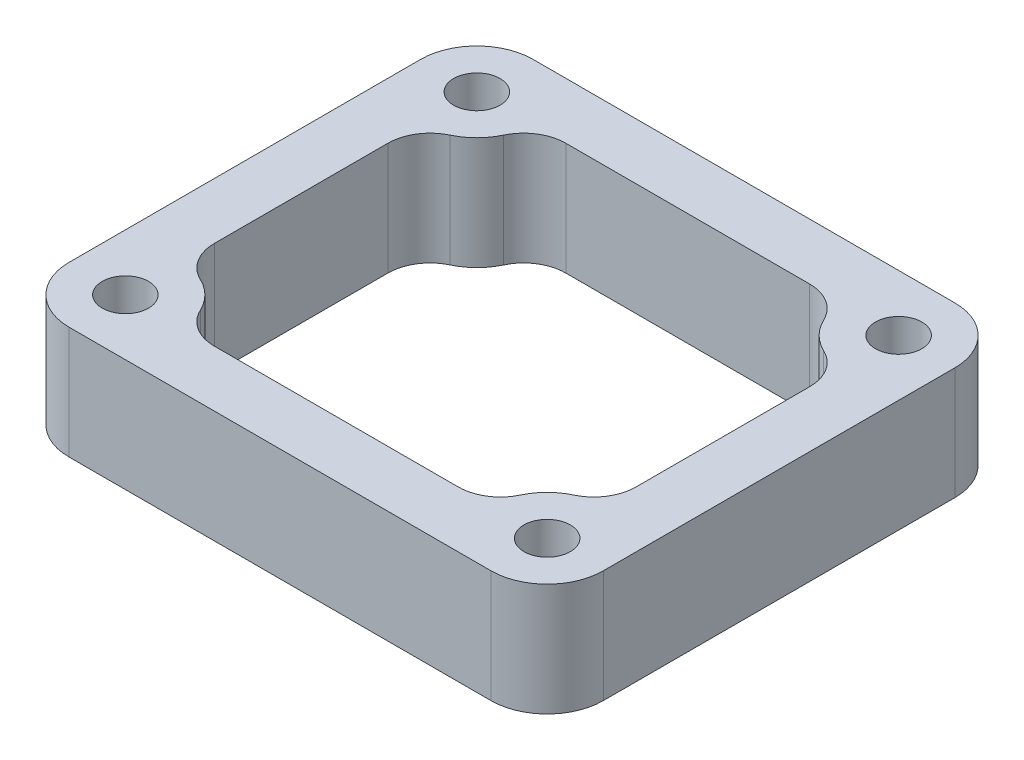
ISO-10303-21;
HEADER;
FILE_DESCRIPTION(('STEP AP214'),'2;1');
FILE_NAME('part.step','',(''),(''),'','','');
FILE_SCHEMA(('AUTOMOTIVE_DESIGN { 1 0 10303 214 1 1 1 1 }'));
ENDSEC;
DATA;
#1=APPLICATION_CONTEXT('core data for automotive mechanical design processes');
#2=APPLICATION_PROTOCOL_DEFINITION('international standard','automotive_design',2000,#1);
#3=PRODUCT_CONTEXT('',#1,'mechanical');
#4=PRODUCT('Part','Part','',(#3));
#5=PRODUCT_RELATED_PRODUCT_CATEGORY('part','',(#4));
#6=PRODUCT_DEFINITION_FORMATION('','',#4);
#7=PRODUCT_DEFINITION_CONTEXT('part definition',#1,'design');
#8=PRODUCT_DEFINITION('design','',#6,#7);
#9=PRODUCT_DEFINITION_SHAPE('','',#8);
#10=(LENGTH_UNIT() NAMED_UNIT(*) SI_UNIT(.MILLI.,.METRE.));
#11=(NAMED_UNIT(*) PLANE_ANGLE_UNIT() SI_UNIT($,.RADIAN.));
#12=(NAMED_UNIT(*) SI_UNIT($,.STERADIAN.) SOLID_ANGLE_UNIT());
#13=UNCERTAINTY_MEASURE_WITH_UNIT(LENGTH_MEASURE(1.E-05),#10,'distance_accuracy_value','');
#14=(GEOMETRIC_REPRESENTATION_CONTEXT(3) GLOBAL_UNCERTAINTY_ASSIGNED_CONTEXT((#13)) GLOBAL_UNIT_ASSIGNED_CONTEXT((#10,
#11,#12)) REPRESENTATION_CONTEXT('',''));
#15=CARTESIAN_POINT('',(0.,0.,0.));
#16=DIRECTION('',(0.,0.,1.));
#17=DIRECTION('',(1.,0.,0.));
#18=AXIS2_PLACEMENT_3D('',#15,#16,#17);
#19=CARTESIAN_POINT('',(-15.,8.,-12.5));
#20=DIRECTION('',(0.,1.,0.));
#21=DIRECTION('',(0.,0.,1.));
#22=AXIS2_PLACEMENT_3D('',#19,#20,#21);
#23=PLANE('',#22);
#24=CARTESIAN_POINT('',(-15.,8.,12.5));
#25=DIRECTION('',(0.,1.,0.));
#26=DIRECTION('',(0.,0.,1.));
#27=AXIS2_PLACEMENT_3D('',#24,#25,#26);
#28=CIRCLE('',#27,1.65);
#29=CARTESIAN_POINT('',(-15.,8.,14.15));
#30=VERTEX_POINT('',#29);
#31=EDGE_CURVE('E354',#30,#30,#28,.T.);
#32=ORIENTED_EDGE('',*,*,#31,.F.);
#33=EDGE_LOOP('',(#32));
#34=FACE_BOUND('',#33,.T.);
#35=CARTESIAN_POINT('',(-15.,8.,-12.5));
#36=DIRECTION('',(0.,1.,0.));
#37=DIRECTION('',(0.,0.,1.));
#38=AXIS2_PLACEMENT_3D('',#35,#36,#37);
#39=CIRCLE('',#38,1.65);
#40=CARTESIAN_POINT('',(-15.,8.,-10.85));
#41=VERTEX_POINT('',#40);
#42=EDGE_CURVE('E366',#41,#41,#39,.T.);
#43=ORIENTED_EDGE('',*,*,#42,.F.);
#44=EDGE_LOOP('',(#43));
#45=FACE_BOUND('',#44,.T.);
#46=CARTESIAN_POINT('',(-15.,8.,-12.5));
#47=DIRECTION('',(0.,1.,0.));
#48=DIRECTION('',(0.,0.,1.));
#49=AXIS2_PLACEMENT_3D('',#46,#47,#48);
#50=CIRCLE('',#49,4.);
#51=CARTESIAN_POINT('',(-15.,8.,-16.5));
#52=VERTEX_POINT('',#51);
#53=CARTESIAN_POINT('',(-19.,8.,-12.5));
#54=VERTEX_POINT('',#53);
#55=EDGE_CURVE('E216',#52,#54,#50,.T.);
#56=ORIENTED_EDGE('',*,*,#55,.T.);
#57=DIRECTION('',(0.,0.,1.));
#58=VECTOR('',#57,1.);
#59=CARTESIAN_POINT('',(-19.,8.,-12.5));
#60=LINE('',#59,#58);
#61=CARTESIAN_POINT('',(-19.,8.,12.5));
#62=VERTEX_POINT('',#61);
#63=EDGE_CURVE('E205',#54,#62,#60,.T.);
#64=ORIENTED_EDGE('',*,*,#63,.T.);
#65=CARTESIAN_POINT('',(-15.,8.,12.5));
#66=DIRECTION('',(0.,1.,0.));
#67=DIRECTION('',(0.,0.,1.));
#68=AXIS2_PLACEMENT_3D('',#65,#66,#67);
#69=CIRCLE('',#68,4.);
#70=CARTESIAN_POINT('',(-15.,8.,16.5));
#71=VERTEX_POINT('',#70);
#72=EDGE_CURVE('E215',#62,#71,#69,.T.);
#73=ORIENTED_EDGE('',*,*,#72,.T.);
#74=DIRECTION('',(1.,0.,0.));
#75=VECTOR('',#74,1.);
#76=CARTESIAN_POINT('',(15.,8.,16.5));
#77=LINE('',#76,#75);
#78=CARTESIAN_POINT('',(15.,8.,16.5));
#79=VERTEX_POINT('',#78);
#80=EDGE_CURVE('E372',#71,#79,#77,.T.);
#81=ORIENTED_EDGE('',*,*,#80,.T.);
#82=CARTESIAN_POINT('',(15.,8.,12.5));
#83=DIRECTION('',(0.,1.,0.));
#84=DIRECTION('',(0.,0.,1.));
#85=AXIS2_PLACEMENT_3D('',#82,#83,#84);
#86=CIRCLE('',#85,4.);
#87=CARTESIAN_POINT('',(19.,8.,12.5));
#88=VERTEX_POINT('',#87);
#89=EDGE_CURVE('E374',#79,#88,#86,.T.);
#90=ORIENTED_EDGE('',*,*,#89,.T.);
#91=DIRECTION('',(0.,0.,-1.));
#92=VECTOR('',#91,1.);
#93=CARTESIAN_POINT('',(19.,8.,-12.5));
#94=LINE('',#93,#92);
#95=CARTESIAN_POINT('',(19.,8.,-12.5));
#96=VERTEX_POINT('',#95);
#97=EDGE_CURVE('E376',#88,#96,#94,.T.);
#98=ORIENTED_EDGE('',*,*,#97,.T.);
#99=CARTESIAN_POINT('',(15.,8.,-12.5));
#100=DIRECTION('',(0.,1.,0.));
#101=DIRECTION('',(0.,0.,1.));
#102=AXIS2_PLACEMENT_3D('',#99,#100,#101);
#103=CIRCLE('',#102,4.);
#104=CARTESIAN_POINT('',(15.,8.,-16.5));
#105=VERTEX_POINT('',#104);
#106=EDGE_CURVE('E378',#96,#105,#103,.T.);
#107=ORIENTED_EDGE('',*,*,#106,.T.);
#108=DIRECTION('',(-1.,0.,0.));
#109=VECTOR('',#108,1.);
#110=CARTESIAN_POINT('',(-15.,8.,-16.5));
#111=LINE('',#110,#109);
#112=EDGE_CURVE('E221',#105,#52,#111,.T.);
#113=ORIENTED_EDGE('',*,*,#112,.T.);
#114=EDGE_LOOP('',(#56,#64,#73,#81,#90,#98,#107,#113));
#115=FACE_BOUND('',#114,.T.);
#116=CARTESIAN_POINT('',(15.,8.,-12.5));
#117=DIRECTION('',(0.,1.,0.));
#118=DIRECTION('',(0.,0.,1.));
#119=AXIS2_PLACEMENT_3D('',#116,#117,#118);
#120=CIRCLE('',#119,1.65);
#121=CARTESIAN_POINT('',(15.,8.,-10.85));
#122=VERTEX_POINT('',#121);
#123=EDGE_CURVE('E360',#122,#122,#120,.T.);
#124=ORIENTED_EDGE('',*,*,#123,.F.);
#125=EDGE_LOOP('',(#124));
#126=FACE_BOUND('',#125,.T.);
#127=CARTESIAN_POINT('',(15.,8.,12.5));
#128=DIRECTION('',(0.,1.,0.));
#129=DIRECTION('',(0.,0.,1.));
#130=AXIS2_PLACEMENT_3D('',#127,#128,#129);
#131=CIRCLE('',#130,1.65);
#132=CARTESIAN_POINT('',(15.,8.,14.15));
#133=VERTEX_POINT('',#132);
#134=EDGE_CURVE('E326',#133,#133,#131,.T.);
#135=ORIENTED_EDGE('',*,*,#134,.F.);
#136=EDGE_LOOP('',(#135));
#137=FACE_BOUND('',#136,.T.);
#138=DIRECTION('',(0.,0.,1.));
#139=VECTOR('',#138,1.);
#140=CARTESIAN_POINT('',(-15.,8.,-8.5));
#141=LINE('',#140,#139);
#142=CARTESIAN_POINT('',(-15.,8.,-6.17544467966324));
#143=VERTEX_POINT('',#142);
#144=CARTESIAN_POINT('',(-15.,8.,6.17544467966324));
#145=VERTEX_POINT('',#144);
#146=EDGE_CURVE('E716',#143,#145,#141,.T.);
#147=ORIENTED_EDGE('',*,*,#146,.F.);
#148=CARTESIAN_POINT('',(-12.,8.,-6.17544467966324));
#149=DIRECTION('',(0.,1.,0.));
#150=DIRECTION('',(0.,0.,1.));
#151=AXIS2_PLACEMENT_3D('',#148,#149,#150);
#152=CIRCLE('',#151,3.);
#153=CARTESIAN_POINT('',(-13.2857142857143,8.,-8.885968388379));
#154=VERTEX_POINT('',#153);
#155=EDGE_CURVE('E58',#143,#154,#152,.F.);
#156=ORIENTED_EDGE('',*,*,#155,.T.);
#157=CARTESIAN_POINT('',(-15.,8.,-12.5));
#158=DIRECTION('',(0.,-1.,0.));
#159=DIRECTION('',(0.,0.,1.));
#160=AXIS2_PLACEMENT_3D('',#157,#158,#159);
#161=CIRCLE('',#160,4.);
#162=CARTESIAN_POINT('',(-11.385968388379,8.,-10.7857142857143));
#163=VERTEX_POINT('',#162);
#164=EDGE_CURVE('E318',#163,#154,#161,.T.);
#165=ORIENTED_EDGE('',*,*,#164,.F.);
#166=CARTESIAN_POINT('',(-8.67544467966323,8.,-9.5));
#167=DIRECTION('',(0.,1.,0.));
#168=DIRECTION('',(0.,0.,1.));
#169=AXIS2_PLACEMENT_3D('',#166,#167,#168);
#170=CIRCLE('',#169,3.);
#171=CARTESIAN_POINT('',(-8.67544467966323,8.,-12.5));
#172=VERTEX_POINT('',#171);
#173=EDGE_CURVE('E11',#163,#172,#170,.F.);
#174=ORIENTED_EDGE('',*,*,#173,.T.);
#175=DIRECTION('',(-1.,0.,0.));
#176=VECTOR('',#175,1.);
#177=CARTESIAN_POINT('',(-11.,8.,-12.5));
#178=LINE('',#177,#176);
#179=CARTESIAN_POINT('',(8.67544467966325,8.,-12.5));
#180=VERTEX_POINT('',#179);
#181=EDGE_CURVE('E316',#180,#172,#178,.T.);
#182=ORIENTED_EDGE('',*,*,#181,.F.);
#183=CARTESIAN_POINT('',(8.67544467966325,8.,-9.5));
#184=DIRECTION('',(0.,1.,0.));
#185=DIRECTION('',(0.,0.,1.));
#186=AXIS2_PLACEMENT_3D('',#183,#184,#185);
#187=CIRCLE('',#186,3.);
#188=CARTESIAN_POINT('',(11.385968388379,8.,-10.7857142857143));
#189=VERTEX_POINT('',#188);
#190=EDGE_CURVE('E296',#180,#189,#187,.F.);
#191=ORIENTED_EDGE('',*,*,#190,.T.);
#192=CARTESIAN_POINT('',(15.,8.,-12.5));
#193=DIRECTION('',(0.,-1.,0.));
#194=DIRECTION('',(0.,0.,1.));
#195=AXIS2_PLACEMENT_3D('',#192,#193,#194);
#196=CIRCLE('',#195,4.);
#197=CARTESIAN_POINT('',(13.2857142857143,8.,-8.885968388379));
#198=VERTEX_POINT('',#197);
#199=EDGE_CURVE('E323',#198,#189,#196,.T.);
#200=ORIENTED_EDGE('',*,*,#199,.F.);
#201=CARTESIAN_POINT('',(12.,8.,-6.17544467966324));
#202=DIRECTION('',(0.,1.,0.));
#203=DIRECTION('',(0.,0.,1.));
#204=AXIS2_PLACEMENT_3D('',#201,#202,#203);
#205=CIRCLE('',#204,3.);
#206=CARTESIAN_POINT('',(15.,8.,-6.17544467966324));
#207=VERTEX_POINT('',#206);
#208=EDGE_CURVE('E292',#198,#207,#205,.F.);
#209=ORIENTED_EDGE('',*,*,#208,.T.);
#210=DIRECTION('',(0.,0.,-1.));
#211=VECTOR('',#210,1.);
#212=CARTESIAN_POINT('',(15.,8.,8.5));
#213=LINE('',#212,#211);
#214=CARTESIAN_POINT('',(15.,8.,6.17544467966325));
#215=VERTEX_POINT('',#214);
#216=EDGE_CURVE('E329',#215,#207,#213,.T.);
#217=ORIENTED_EDGE('',*,*,#216,.F.);
#218=CARTESIAN_POINT('',(12.,8.,6.17544467966325));
#219=DIRECTION('',(0.,1.,0.));
#220=DIRECTION('',(0.,0.,1.));
#221=AXIS2_PLACEMENT_3D('',#218,#219,#220);
#222=CIRCLE('',#221,3.);
#223=CARTESIAN_POINT('',(13.2857142857143,8.,8.885968388379));
#224=VERTEX_POINT('',#223);
#225=EDGE_CURVE('E288',#215,#224,#222,.F.);
#226=ORIENTED_EDGE('',*,*,#225,.T.);
#227=CARTESIAN_POINT('',(15.,8.,12.5));
#228=DIRECTION('',(0.,-1.,0.));
#229=DIRECTION('',(0.,0.,1.));
#230=AXIS2_PLACEMENT_3D('',#227,#228,#229);
#231=CIRCLE('',#230,4.);
#232=CARTESIAN_POINT('',(11.385968388379,8.,10.7857142857143));
#233=VERTEX_POINT('',#232);
#234=EDGE_CURVE('E737',#233,#224,#231,.T.);
#235=ORIENTED_EDGE('',*,*,#234,.F.);
#236=CARTESIAN_POINT('',(8.67544467966325,8.,9.5));
#237=DIRECTION('',(0.,1.,0.));
#238=DIRECTION('',(0.,0.,1.));
#239=AXIS2_PLACEMENT_3D('',#236,#237,#238);
#240=CIRCLE('',#239,3.);
#241=CARTESIAN_POINT('',(8.67544467966325,8.,12.5));
#242=VERTEX_POINT('',#241);
#243=EDGE_CURVE('E284',#233,#242,#240,.F.);
#244=ORIENTED_EDGE('',*,*,#243,.T.);
#245=DIRECTION('',(1.,0.,0.));
#246=VECTOR('',#245,1.);
#247=CARTESIAN_POINT('',(-11.,8.,12.5));
#248=LINE('',#247,#246);
#249=CARTESIAN_POINT('',(-8.67544467966323,8.,12.5));
#250=VERTEX_POINT('',#249);
#251=EDGE_CURVE('E730',#250,#242,#248,.T.);
#252=ORIENTED_EDGE('',*,*,#251,.F.);
#253=CARTESIAN_POINT('',(-8.67544467966323,8.,9.5));
#254=DIRECTION('',(0.,1.,0.));
#255=DIRECTION('',(0.,0.,1.));
#256=AXIS2_PLACEMENT_3D('',#253,#254,#255);
#257=CIRCLE('',#256,3.);
#258=CARTESIAN_POINT('',(-11.385968388379,8.,10.7857142857143));
#259=VERTEX_POINT('',#258);
#260=EDGE_CURVE('E280',#250,#259,#257,.F.);
#261=ORIENTED_EDGE('',*,*,#260,.T.);
#262=CARTESIAN_POINT('',(-15.,8.,12.5));
#263=DIRECTION('',(0.,-1.,0.));
#264=DIRECTION('',(0.,0.,1.));
#265=AXIS2_PLACEMENT_3D('',#262,#263,#264);
#266=CIRCLE('',#265,4.);
#267=CARTESIAN_POINT('',(-13.2857142857143,8.,8.885968388379));
#268=VERTEX_POINT('',#267);
#269=EDGE_CURVE('E723',#268,#259,#266,.T.);
#270=ORIENTED_EDGE('',*,*,#269,.F.);
#271=CARTESIAN_POINT('',(-12.,8.,6.17544467966324));
#272=DIRECTION('',(0.,1.,0.));
#273=DIRECTION('',(0.,0.,1.));
#274=AXIS2_PLACEMENT_3D('',#271,#272,#273);
#275=CIRCLE('',#274,3.);
#276=EDGE_CURVE('E276',#268,#145,#275,.F.);
#277=ORIENTED_EDGE('',*,*,#276,.T.);
#278=EDGE_LOOP('',(#147,#156,#165,#174,#182,#191,#200,#209,#217,#226,#235,#244,#252,#261,#270,#277));
#279=FACE_BOUND('',#278,.T.);
#280=ADVANCED_FACE('F43',(#34,#45,#115,#126,#137,#279),#23,.T.);
#281=CARTESIAN_POINT('',(-15.,0.,-12.5));
#282=DIRECTION('',(0.,1.,0.));
#283=DIRECTION('',(0.,0.,1.));
#284=AXIS2_PLACEMENT_3D('',#281,#282,#283);
#285=PLANE('',#284);
#286=CARTESIAN_POINT('',(15.,0.,12.5));
#287=DIRECTION('',(0.,1.,0.));
#288=DIRECTION('',(0.,0.,1.));
#289=AXIS2_PLACEMENT_3D('',#286,#287,#288);
#290=CIRCLE('',#289,1.65);
#291=CARTESIAN_POINT('',(15.,0.,14.15));
#292=VERTEX_POINT('',#291);
#293=EDGE_CURVE('E322',#292,#292,#290,.T.);
#294=ORIENTED_EDGE('',*,*,#293,.T.);
#295=EDGE_LOOP('',(#294));
#296=FACE_BOUND('',#295,.T.);
#297=CARTESIAN_POINT('',(-15.,0.,12.5));
#298=DIRECTION('',(0.,1.,0.));
#299=DIRECTION('',(0.,0.,1.));
#300=AXIS2_PLACEMENT_3D('',#297,#298,#299);
#301=CIRCLE('',#300,1.65);
#302=CARTESIAN_POINT('',(-15.,0.,14.15));
#303=VERTEX_POINT('',#302);
#304=EDGE_CURVE('E352',#303,#303,#301,.T.);
#305=ORIENTED_EDGE('',*,*,#304,.T.);
#306=EDGE_LOOP('',(#305));
#307=FACE_BOUND('',#306,.T.);
#308=CARTESIAN_POINT('',(15.,0.,-12.5));
#309=DIRECTION('',(0.,1.,0.));
#310=DIRECTION('',(0.,0.,1.));
#311=AXIS2_PLACEMENT_3D('',#308,#309,#310);
#312=CIRCLE('',#311,1.65);
#313=CARTESIAN_POINT('',(15.,0.,-10.85));
#314=VERTEX_POINT('',#313);
#315=EDGE_CURVE('E357',#314,#314,#312,.T.);
#316=ORIENTED_EDGE('',*,*,#315,.T.);
#317=EDGE_LOOP('',(#316));
#318=FACE_BOUND('',#317,.T.);
#319=CARTESIAN_POINT('',(-15.,0.,-12.5));
#320=DIRECTION('',(0.,1.,0.));
#321=DIRECTION('',(0.,0.,1.));
#322=AXIS2_PLACEMENT_3D('',#319,#320,#321);
#323=CIRCLE('',#322,1.65);
#324=CARTESIAN_POINT('',(-15.,0.,-10.85));
#325=VERTEX_POINT('',#324);
#326=EDGE_CURVE('E363',#325,#325,#323,.T.);
#327=ORIENTED_EDGE('',*,*,#326,.T.);
#328=EDGE_LOOP('',(#327));
#329=FACE_BOUND('',#328,.T.);
#330=CARTESIAN_POINT('',(-15.,0.,-12.5));
#331=DIRECTION('',(0.,1.,0.));
#332=DIRECTION('',(0.,0.,1.));
#333=AXIS2_PLACEMENT_3D('',#330,#331,#332);
#334=CIRCLE('',#333,4.);
#335=CARTESIAN_POINT('',(-15.,0.,-16.5));
#336=VERTEX_POINT('',#335);
#337=CARTESIAN_POINT('',(-19.,0.,-12.5));
#338=VERTEX_POINT('',#337);
#339=EDGE_CURVE('E229',#336,#338,#334,.T.);
#340=ORIENTED_EDGE('',*,*,#339,.F.);
#341=DIRECTION('',(-1.,0.,0.));
#342=VECTOR('',#341,1.);
#343=CARTESIAN_POINT('',(-15.,0.,-16.5));
#344=LINE('',#343,#342);
#345=CARTESIAN_POINT('',(15.,0.,-16.5));
#346=VERTEX_POINT('',#345);
#347=EDGE_CURVE('E225',#346,#336,#344,.T.);
#348=ORIENTED_EDGE('',*,*,#347,.F.);
#349=CARTESIAN_POINT('',(15.,0.,-12.5));
#350=DIRECTION('',(0.,1.,0.));
#351=DIRECTION('',(0.,0.,1.));
#352=AXIS2_PLACEMENT_3D('',#349,#350,#351);
#353=CIRCLE('',#352,4.);
#354=CARTESIAN_POINT('',(19.,0.,-12.5));
#355=VERTEX_POINT('',#354);
#356=EDGE_CURVE('E393',#355,#346,#353,.T.);
#357=ORIENTED_EDGE('',*,*,#356,.F.);
#358=DIRECTION('',(0.,0.,-1.));
#359=VECTOR('',#358,1.);
#360=CARTESIAN_POINT('',(19.,0.,-12.5));
#361=LINE('',#360,#359);
#362=CARTESIAN_POINT('',(19.,0.,12.5));
#363=VERTEX_POINT('',#362);
#364=EDGE_CURVE('E391',#363,#355,#361,.T.);
#365=ORIENTED_EDGE('',*,*,#364,.F.);
#366=CARTESIAN_POINT('',(15.,0.,12.5));
#367=DIRECTION('',(0.,1.,0.));
#368=DIRECTION('',(0.,0.,1.));
#369=AXIS2_PLACEMENT_3D('',#366,#367,#368);
#370=CIRCLE('',#369,4.);
#371=CARTESIAN_POINT('',(15.,0.,16.5));
#372=VERTEX_POINT('',#371);
#373=EDGE_CURVE('E389',#372,#363,#370,.T.);
#374=ORIENTED_EDGE('',*,*,#373,.F.);
#375=DIRECTION('',(1.,0.,0.));
#376=VECTOR('',#375,1.);
#377=CARTESIAN_POINT('',(15.,0.,16.5));
#378=LINE('',#377,#376);
#379=CARTESIAN_POINT('',(-15.,0.,16.5));
#380=VERTEX_POINT('',#379);
#381=EDGE_CURVE('E387',#380,#372,#378,.T.);
#382=ORIENTED_EDGE('',*,*,#381,.F.);
#383=CARTESIAN_POINT('',(-15.,0.,12.5));
#384=DIRECTION('',(0.,1.,0.));
#385=DIRECTION('',(0.,0.,1.));
#386=AXIS2_PLACEMENT_3D('',#383,#384,#385);
#387=CIRCLE('',#386,4.);
#388=CARTESIAN_POINT('',(-19.,0.,12.5));
#389=VERTEX_POINT('',#388);
#390=EDGE_CURVE('E385',#389,#380,#387,.T.);
#391=ORIENTED_EDGE('',*,*,#390,.F.);
#392=DIRECTION('',(0.,0.,1.));
#393=VECTOR('',#392,1.);
#394=CARTESIAN_POINT('',(-19.,0.,-12.5));
#395=LINE('',#394,#393);
#396=EDGE_CURVE('E383',#338,#389,#395,.T.);
#397=ORIENTED_EDGE('',*,*,#396,.F.);
#398=EDGE_LOOP('',(#340,#348,#357,#365,#374,#382,#391,#397));
#399=FACE_BOUND('',#398,.T.);
#400=DIRECTION('',(-1.,0.,0.));
#401=VECTOR('',#400,1.);
#402=CARTESIAN_POINT('',(-11.,0.,-12.5));
#403=LINE('',#402,#401);
#404=CARTESIAN_POINT('',(8.67544467966325,0.,-12.5));
#405=VERTEX_POINT('',#404);
#406=CARTESIAN_POINT('',(-8.67544467966323,0.,-12.5));
#407=VERTEX_POINT('',#406);
#408=EDGE_CURVE('E306',#405,#407,#403,.T.);
#409=ORIENTED_EDGE('',*,*,#408,.T.);
#410=CARTESIAN_POINT('',(-8.67544467966323,0.,-9.5));
#411=DIRECTION('',(0.,1.,0.));
#412=DIRECTION('',(0.,0.,1.));
#413=AXIS2_PLACEMENT_3D('',#410,#411,#412);
#414=CIRCLE('',#413,3.);
#415=CARTESIAN_POINT('',(-11.385968388379,0.,-10.7857142857143));
#416=VERTEX_POINT('',#415);
#417=EDGE_CURVE('E51',#407,#416,#414,.T.);
#418=ORIENTED_EDGE('',*,*,#417,.T.);
#419=CARTESIAN_POINT('',(-15.,0.,-12.5));
#420=DIRECTION('',(0.,-1.,0.));
#421=DIRECTION('',(0.,0.,1.));
#422=AXIS2_PLACEMENT_3D('',#419,#420,#421);
#423=CIRCLE('',#422,4.);
#424=CARTESIAN_POINT('',(-13.2857142857143,0.,-8.885968388379));
#425=VERTEX_POINT('',#424);
#426=EDGE_CURVE('E304',#416,#425,#423,.T.);
#427=ORIENTED_EDGE('',*,*,#426,.T.);
#428=CARTESIAN_POINT('',(-12.,0.,-6.17544467966324));
#429=DIRECTION('',(0.,1.,0.));
#430=DIRECTION('',(0.,0.,1.));
#431=AXIS2_PLACEMENT_3D('',#428,#429,#430);
#432=CIRCLE('',#431,3.);
#433=CARTESIAN_POINT('',(-15.,0.,-6.17544467966324));
#434=VERTEX_POINT('',#433);
#435=EDGE_CURVE('E298',#425,#434,#432,.T.);
#436=ORIENTED_EDGE('',*,*,#435,.T.);
#437=DIRECTION('',(0.,0.,1.));
#438=VECTOR('',#437,1.);
#439=CARTESIAN_POINT('',(-15.,0.,-8.5));
#440=LINE('',#439,#438);
#441=CARTESIAN_POINT('',(-15.,0.,6.17544467966324));
#442=VERTEX_POINT('',#441);
#443=EDGE_CURVE('E311',#434,#442,#440,.T.);
#444=ORIENTED_EDGE('',*,*,#443,.T.);
#445=CARTESIAN_POINT('',(-12.,0.,6.17544467966324));
#446=DIRECTION('',(0.,1.,0.));
#447=DIRECTION('',(0.,0.,1.));
#448=AXIS2_PLACEMENT_3D('',#445,#446,#447);
#449=CIRCLE('',#448,3.);
#450=CARTESIAN_POINT('',(-13.2857142857143,0.,8.885968388379));
#451=VERTEX_POINT('',#450);
#452=EDGE_CURVE('E274',#442,#451,#449,.T.);
#453=ORIENTED_EDGE('',*,*,#452,.T.);
#454=CARTESIAN_POINT('',(-15.,0.,12.5));
#455=DIRECTION('',(0.,-1.,0.));
#456=DIRECTION('',(0.,0.,1.));
#457=AXIS2_PLACEMENT_3D('',#454,#455,#456);
#458=CIRCLE('',#457,4.);
#459=CARTESIAN_POINT('',(-11.385968388379,0.,10.7857142857143));
#460=VERTEX_POINT('',#459);
#461=EDGE_CURVE('E335',#451,#460,#458,.T.);
#462=ORIENTED_EDGE('',*,*,#461,.T.);
#463=CARTESIAN_POINT('',(-8.67544467966323,0.,9.5));
#464=DIRECTION('',(0.,1.,0.));
#465=DIRECTION('',(0.,0.,1.));
#466=AXIS2_PLACEMENT_3D('',#463,#464,#465);
#467=CIRCLE('',#466,3.);
#468=CARTESIAN_POINT('',(-8.67544467966323,0.,12.5));
#469=VERTEX_POINT('',#468);
#470=EDGE_CURVE('E278',#460,#469,#467,.T.);
#471=ORIENTED_EDGE('',*,*,#470,.T.);
#472=DIRECTION('',(1.,0.,0.));
#473=VECTOR('',#472,1.);
#474=CARTESIAN_POINT('',(-11.,0.,12.5));
#475=LINE('',#474,#473);
#476=CARTESIAN_POINT('',(8.67544467966325,0.,12.5));
#477=VERTEX_POINT('',#476);
#478=EDGE_CURVE('E338',#469,#477,#475,.T.);
#479=ORIENTED_EDGE('',*,*,#478,.T.);
#480=CARTESIAN_POINT('',(8.67544467966325,0.,9.5));
#481=DIRECTION('',(0.,1.,0.));
#482=DIRECTION('',(0.,0.,1.));
#483=AXIS2_PLACEMENT_3D('',#480,#481,#482);
#484=CIRCLE('',#483,3.);
#485=CARTESIAN_POINT('',(11.385968388379,0.,10.7857142857143));
#486=VERTEX_POINT('',#485);
#487=EDGE_CURVE('E282',#477,#486,#484,.T.);
#488=ORIENTED_EDGE('',*,*,#487,.T.);
#489=CARTESIAN_POINT('',(15.,0.,12.5));
#490=DIRECTION('',(0.,-1.,0.));
#491=DIRECTION('',(0.,0.,1.));
#492=AXIS2_PLACEMENT_3D('',#489,#490,#491);
#493=CIRCLE('',#492,4.);
#494=CARTESIAN_POINT('',(13.2857142857143,0.,8.885968388379));
#495=VERTEX_POINT('',#494);
#496=EDGE_CURVE('E341',#486,#495,#493,.T.);
#497=ORIENTED_EDGE('',*,*,#496,.T.);
#498=CARTESIAN_POINT('',(12.,0.,6.17544467966325));
#499=DIRECTION('',(0.,1.,0.));
#500=DIRECTION('',(0.,0.,1.));
#501=AXIS2_PLACEMENT_3D('',#498,#499,#500);
#502=CIRCLE('',#501,3.);
#503=CARTESIAN_POINT('',(15.,0.,6.17544467966325));
#504=VERTEX_POINT('',#503);
#505=EDGE_CURVE('E286',#495,#504,#502,.T.);
#506=ORIENTED_EDGE('',*,*,#505,.T.);
#507=DIRECTION('',(0.,0.,-1.));
#508=VECTOR('',#507,1.);
#509=CARTESIAN_POINT('',(15.,0.,8.5));
#510=LINE('',#509,#508);
#511=CARTESIAN_POINT('',(15.,0.,-6.17544467966324));
#512=VERTEX_POINT('',#511);
#513=EDGE_CURVE('E344',#504,#512,#510,.T.);
#514=ORIENTED_EDGE('',*,*,#513,.T.);
#515=CARTESIAN_POINT('',(12.,0.,-6.17544467966324));
#516=DIRECTION('',(0.,1.,0.));
#517=DIRECTION('',(0.,0.,1.));
#518=AXIS2_PLACEMENT_3D('',#515,#516,#517);
#519=CIRCLE('',#518,3.);
#520=CARTESIAN_POINT('',(13.2857142857143,0.,-8.885968388379));
#521=VERTEX_POINT('',#520);
#522=EDGE_CURVE('E290',#512,#521,#519,.T.);
#523=ORIENTED_EDGE('',*,*,#522,.T.);
#524=CARTESIAN_POINT('',(15.,0.,-12.5));
#525=DIRECTION('',(0.,-1.,0.));
#526=DIRECTION('',(0.,0.,1.));
#527=AXIS2_PLACEMENT_3D('',#524,#525,#526);
#528=CIRCLE('',#527,4.);
#529=CARTESIAN_POINT('',(11.385968388379,0.,-10.7857142857143));
#530=VERTEX_POINT('',#529);
#531=EDGE_CURVE('E347',#521,#530,#528,.T.);
#532=ORIENTED_EDGE('',*,*,#531,.T.);
#533=CARTESIAN_POINT('',(8.67544467966325,0.,-9.5));
#534=DIRECTION('',(0.,1.,0.));
#535=DIRECTION('',(0.,0.,1.));
#536=AXIS2_PLACEMENT_3D('',#533,#534,#535);
#537=CIRCLE('',#536,3.);
#538=EDGE_CURVE('E294',#530,#405,#537,.T.);
#539=ORIENTED_EDGE('',*,*,#538,.T.);
#540=EDGE_LOOP('',(#409,#418,#427,#436,#444,#453,#462,#471,#479,#488,#497,#506,#514,#523,#532,#539));
#541=FACE_BOUND('',#540,.T.);
#542=ADVANCED_FACE('F303',(#296,#307,#318,#329,#399,#541),#285,.F.);
#543=CARTESIAN_POINT('',(-15.,8.,-12.5));
#544=DIRECTION('',(0.,-1.,0.));
#545=DIRECTION('',(0.,0.,-1.));
#546=AXIS2_PLACEMENT_3D('',#543,#544,#545);
#547=CYLINDRICAL_SURFACE('',#546,4.);
#548=ORIENTED_EDGE('',*,*,#339,.T.);
#549=DIRECTION('',(0.,-1.,0.));
#550=VECTOR('',#549,1.);
#551=CARTESIAN_POINT('',(-19.,8.,-12.5));
#552=LINE('',#551,#550);
#553=EDGE_CURVE('E209',#54,#338,#552,.T.);
#554=ORIENTED_EDGE('',*,*,#553,.F.);
#555=ORIENTED_EDGE('',*,*,#55,.F.);
#556=DIRECTION('',(0.,-1.,0.));
#557=VECTOR('',#556,1.);
#558=CARTESIAN_POINT('',(-15.,8.,-16.5));
#559=LINE('',#558,#557);
#560=EDGE_CURVE('E381',#52,#336,#559,.T.);
#561=ORIENTED_EDGE('',*,*,#560,.T.);
#562=EDGE_LOOP('',(#548,#554,#555,#561));
#563=FACE_BOUND('',#562,.T.);
#564=ADVANCED_FACE('F227',(#563),#547,.T.);
#565=CARTESIAN_POINT('',(-19.,8.,-12.5));
#566=DIRECTION('',(1.,0.,0.));
#567=DIRECTION('',(0.,0.,-1.));
#568=AXIS2_PLACEMENT_3D('',#565,#566,#567);
#569=PLANE('',#568);
#570=ORIENTED_EDGE('',*,*,#396,.T.);
#571=DIRECTION('',(0.,-1.,0.));
#572=VECTOR('',#571,1.);
#573=CARTESIAN_POINT('',(-19.,8.,12.5));
#574=LINE('',#573,#572);
#575=EDGE_CURVE('E212',#62,#389,#574,.T.);
#576=ORIENTED_EDGE('',*,*,#575,.F.);
#577=ORIENTED_EDGE('',*,*,#63,.F.);
#578=ORIENTED_EDGE('',*,*,#553,.T.);
#579=EDGE_LOOP('',(#570,#576,#577,#578));
#580=FACE_BOUND('',#579,.T.);
#581=ADVANCED_FACE('F207',(#580),#569,.F.);
#582=CARTESIAN_POINT('',(-15.,8.,12.5));
#583=DIRECTION('',(0.,-1.,0.));
#584=DIRECTION('',(0.,0.,-1.));
#585=AXIS2_PLACEMENT_3D('',#582,#583,#584);
#586=CYLINDRICAL_SURFACE('',#585,4.);
#587=ORIENTED_EDGE('',*,*,#390,.T.);
#588=DIRECTION('',(0.,-1.,0.));
#589=VECTOR('',#588,1.);
#590=CARTESIAN_POINT('',(-15.,8.,16.5));
#591=LINE('',#590,#589);
#592=EDGE_CURVE('E234',#71,#380,#591,.T.);
#593=ORIENTED_EDGE('',*,*,#592,.F.);
#594=ORIENTED_EDGE('',*,*,#72,.F.);
#595=ORIENTED_EDGE('',*,*,#575,.T.);
#596=EDGE_LOOP('',(#587,#593,#594,#595));
#597=FACE_BOUND('',#596,.T.);
#598=ADVANCED_FACE('F431',(#597),#586,.T.);
#599=CARTESIAN_POINT('',(15.,8.,16.5));
#600=DIRECTION('',(0.,0.,-1.));
#601=DIRECTION('',(-1.,0.,0.));
#602=AXIS2_PLACEMENT_3D('',#599,#600,#601);
#603=PLANE('',#602);
#604=ORIENTED_EDGE('',*,*,#381,.T.);
#605=DIRECTION('',(0.,-1.,0.));
#606=VECTOR('',#605,1.);
#607=CARTESIAN_POINT('',(15.,8.,16.5));
#608=LINE('',#607,#606);
#609=EDGE_CURVE('E406',#79,#372,#608,.T.);
#610=ORIENTED_EDGE('',*,*,#609,.F.);
#611=ORIENTED_EDGE('',*,*,#80,.F.);
#612=ORIENTED_EDGE('',*,*,#592,.T.);
#613=EDGE_LOOP('',(#604,#610,#611,#612));
#614=FACE_BOUND('',#613,.T.);
#615=ADVANCED_FACE('F413',(#614),#603,.F.);
#616=CARTESIAN_POINT('',(15.,8.,12.5));
#617=DIRECTION('',(0.,-1.,0.));
#618=DIRECTION('',(0.,0.,-1.));
#619=AXIS2_PLACEMENT_3D('',#616,#617,#618);
#620=CYLINDRICAL_SURFACE('',#619,4.);
#621=ORIENTED_EDGE('',*,*,#373,.T.);
#622=DIRECTION('',(0.,-1.,0.));
#623=VECTOR('',#622,1.);
#624=CARTESIAN_POINT('',(19.,8.,12.5));
#625=LINE('',#624,#623);
#626=EDGE_CURVE('E403',#88,#363,#625,.T.);
#627=ORIENTED_EDGE('',*,*,#626,.F.);
#628=ORIENTED_EDGE('',*,*,#89,.F.);
#629=ORIENTED_EDGE('',*,*,#609,.T.);
#630=EDGE_LOOP('',(#621,#627,#628,#629));
#631=FACE_BOUND('',#630,.T.);
#632=ADVANCED_FACE('F423',(#631),#620,.T.);
#633=CARTESIAN_POINT('',(19.,8.,-12.5));
#634=DIRECTION('',(-1.,0.,0.));
#635=DIRECTION('',(0.,0.,1.));
#636=AXIS2_PLACEMENT_3D('',#633,#634,#635);
#637=PLANE('',#636);
#638=ORIENTED_EDGE('',*,*,#364,.T.);
#639=DIRECTION('',(0.,-1.,0.));
#640=VECTOR('',#639,1.);
#641=CARTESIAN_POINT('',(19.,8.,-12.5));
#642=LINE('',#641,#640);
#643=EDGE_CURVE('E400',#96,#355,#642,.T.);
#644=ORIENTED_EDGE('',*,*,#643,.F.);
#645=ORIENTED_EDGE('',*,*,#97,.F.);
#646=ORIENTED_EDGE('',*,*,#626,.T.);
#647=EDGE_LOOP('',(#638,#644,#645,#646));
#648=FACE_BOUND('',#647,.T.);
#649=ADVANCED_FACE('F427',(#648),#637,.F.);
#650=CARTESIAN_POINT('',(15.,8.,-12.5));
#651=DIRECTION('',(0.,-1.,0.));
#652=DIRECTION('',(0.,0.,-1.));
#653=AXIS2_PLACEMENT_3D('',#650,#651,#652);
#654=CYLINDRICAL_SURFACE('',#653,4.);
#655=ORIENTED_EDGE('',*,*,#356,.T.);
#656=DIRECTION('',(0.,-1.,0.));
#657=VECTOR('',#656,1.);
#658=CARTESIAN_POINT('',(15.,8.,-16.5));
#659=LINE('',#658,#657);
#660=EDGE_CURVE('E397',#105,#346,#659,.T.);
#661=ORIENTED_EDGE('',*,*,#660,.F.);
#662=ORIENTED_EDGE('',*,*,#106,.F.);
#663=ORIENTED_EDGE('',*,*,#643,.T.);
#664=EDGE_LOOP('',(#655,#661,#662,#663));
#665=FACE_BOUND('',#664,.T.);
#666=ADVANCED_FACE('F458',(#665),#654,.T.);
#667=CARTESIAN_POINT('',(-15.,8.,-16.5));
#668=DIRECTION('',(0.,0.,1.));
#669=DIRECTION('',(1.,0.,0.));
#670=AXIS2_PLACEMENT_3D('',#667,#668,#669);
#671=PLANE('',#670);
#672=ORIENTED_EDGE('',*,*,#347,.T.);
#673=ORIENTED_EDGE('',*,*,#560,.F.);
#674=ORIENTED_EDGE('',*,*,#112,.F.);
#675=ORIENTED_EDGE('',*,*,#660,.T.);
#676=EDGE_LOOP('',(#672,#673,#674,#675));
#677=FACE_BOUND('',#676,.T.);
#678=ADVANCED_FACE('F455',(#677),#671,.F.);
#679=CARTESIAN_POINT('',(-15.,8.,-12.5));
#680=DIRECTION('',(0.,-1.,0.));
#681=DIRECTION('',(0.,0.,-1.));
#682=AXIS2_PLACEMENT_3D('',#679,#680,#681);
#683=CYLINDRICAL_SURFACE('',#682,1.65);
#684=ORIENTED_EDGE('',*,*,#42,.T.);
#685=EDGE_LOOP('',(#684));
#686=FACE_BOUND('',#685,.T.);
#687=ORIENTED_EDGE('',*,*,#326,.F.);
#688=EDGE_LOOP('',(#687));
#689=FACE_BOUND('',#688,.T.);
#690=ADVANCED_FACE('F452',(#686,#689),#683,.F.);
#691=CARTESIAN_POINT('',(15.,8.,-12.5));
#692=DIRECTION('',(0.,-1.,0.));
#693=DIRECTION('',(0.,0.,-1.));
#694=AXIS2_PLACEMENT_3D('',#691,#692,#693);
#695=CYLINDRICAL_SURFACE('',#694,1.65);
#696=ORIENTED_EDGE('',*,*,#123,.T.);
#697=EDGE_LOOP('',(#696));
#698=FACE_BOUND('',#697,.T.);
#699=ORIENTED_EDGE('',*,*,#315,.F.);
#700=EDGE_LOOP('',(#699));
#701=FACE_BOUND('',#700,.T.);
#702=ADVANCED_FACE('F492',(#698,#701),#695,.F.);
#703=CARTESIAN_POINT('',(-15.,8.,12.5));
#704=DIRECTION('',(0.,-1.,0.));
#705=DIRECTION('',(0.,0.,-1.));
#706=AXIS2_PLACEMENT_3D('',#703,#704,#705);
#707=CYLINDRICAL_SURFACE('',#706,1.65);
#708=ORIENTED_EDGE('',*,*,#31,.T.);
#709=EDGE_LOOP('',(#708));
#710=FACE_BOUND('',#709,.T.);
#711=ORIENTED_EDGE('',*,*,#304,.F.);
#712=EDGE_LOOP('',(#711));
#713=FACE_BOUND('',#712,.T.);
#714=ADVANCED_FACE('F500',(#710,#713),#707,.F.);
#715=CARTESIAN_POINT('',(15.,8.,12.5));
#716=DIRECTION('',(0.,-1.,0.));
#717=DIRECTION('',(0.,0.,-1.));
#718=AXIS2_PLACEMENT_3D('',#715,#716,#717);
#719=CYLINDRICAL_SURFACE('',#718,1.65);
#720=ORIENTED_EDGE('',*,*,#134,.T.);
#721=EDGE_LOOP('',(#720));
#722=FACE_BOUND('',#721,.T.);
#723=ORIENTED_EDGE('',*,*,#293,.F.);
#724=EDGE_LOOP('',(#723));
#725=FACE_BOUND('',#724,.T.);
#726=ADVANCED_FACE('F507',(#722,#725),#719,.F.);
#727=CARTESIAN_POINT('',(-15.,8.,-12.5));
#728=DIRECTION('',(0.,-1.,0.));
#729=DIRECTION('',(0.,0.,-1.));
#730=AXIS2_PLACEMENT_3D('',#727,#728,#729);
#731=CYLINDRICAL_SURFACE('',#730,4.);
#732=ORIENTED_EDGE('',*,*,#164,.T.);
#733=DIRECTION('',(0.,-1.,0.));
#734=VECTOR('',#733,1.);
#735=CARTESIAN_POINT('',(-13.2857142857143,8.,-8.885968388379));
#736=LINE('',#735,#734);
#737=EDGE_CURVE('E271',#154,#425,#736,.T.);
#738=ORIENTED_EDGE('',*,*,#737,.T.);
#739=ORIENTED_EDGE('',*,*,#426,.F.);
#740=DIRECTION('',(0.,-1.,0.));
#741=VECTOR('',#740,1.);
#742=CARTESIAN_POINT('',(-11.385968388379,8.,-10.7857142857143));
#743=LINE('',#742,#741);
#744=EDGE_CURVE('E65',#416,#163,#743,.F.);
#745=ORIENTED_EDGE('',*,*,#744,.T.);
#746=EDGE_LOOP('',(#732,#738,#739,#745));
#747=FACE_BOUND('',#746,.T.);
#748=ADVANCED_FACE('F309',(#747),#731,.T.);
#749=CARTESIAN_POINT('',(-15.,8.,-8.5));
#750=DIRECTION('',(1.,0.,0.));
#751=DIRECTION('',(0.,0.,-1.));
#752=AXIS2_PLACEMENT_3D('',#749,#750,#751);
#753=PLANE('',#752);
#754=ORIENTED_EDGE('',*,*,#146,.T.);
#755=DIRECTION('',(0.,1.,0.));
#756=VECTOR('',#755,1.);
#757=CARTESIAN_POINT('',(-15.,0.,6.17544467966324));
#758=LINE('',#757,#756);
#759=EDGE_CURVE('E232',#145,#442,#758,.F.);
#760=ORIENTED_EDGE('',*,*,#759,.T.);
#761=ORIENTED_EDGE('',*,*,#443,.F.);
#762=DIRECTION('',(0.,1.,0.));
#763=VECTOR('',#762,1.);
#764=CARTESIAN_POINT('',(-15.,8.,-6.17544467966324));
#765=LINE('',#764,#763);
#766=EDGE_CURVE('E230',#434,#143,#765,.T.);
#767=ORIENTED_EDGE('',*,*,#766,.T.);
#768=EDGE_LOOP('',(#754,#760,#761,#767));
#769=FACE_BOUND('',#768,.T.);
#770=ADVANCED_FACE('F527',(#769),#753,.T.);
#771=CARTESIAN_POINT('',(-15.,8.,12.5));
#772=DIRECTION('',(0.,-1.,0.));
#773=DIRECTION('',(0.,0.,-1.));
#774=AXIS2_PLACEMENT_3D('',#771,#772,#773);
#775=CYLINDRICAL_SURFACE('',#774,4.);
#776=ORIENTED_EDGE('',*,*,#461,.F.);
#777=DIRECTION('',(0.,-1.,0.));
#778=VECTOR('',#777,1.);
#779=CARTESIAN_POINT('',(-13.2857142857143,8.,8.885968388379));
#780=LINE('',#779,#778);
#781=EDGE_CURVE('E243',#451,#268,#780,.F.);
#782=ORIENTED_EDGE('',*,*,#781,.T.);
#783=ORIENTED_EDGE('',*,*,#269,.T.);
#784=DIRECTION('',(0.,-1.,0.));
#785=VECTOR('',#784,1.);
#786=CARTESIAN_POINT('',(-11.385968388379,8.,10.7857142857143));
#787=LINE('',#786,#785);
#788=EDGE_CURVE('E240',#259,#460,#787,.T.);
#789=ORIENTED_EDGE('',*,*,#788,.T.);
#790=EDGE_LOOP('',(#776,#782,#783,#789));
#791=FACE_BOUND('',#790,.T.);
#792=ADVANCED_FACE('F536',(#791),#775,.T.);
#793=CARTESIAN_POINT('',(-11.,8.,12.5));
#794=DIRECTION('',(0.,0.,-1.));
#795=DIRECTION('',(-1.,0.,0.));
#796=AXIS2_PLACEMENT_3D('',#793,#794,#795);
#797=PLANE('',#796);
#798=ORIENTED_EDGE('',*,*,#478,.F.);
#799=DIRECTION('',(0.,1.,0.));
#800=VECTOR('',#799,1.);
#801=CARTESIAN_POINT('',(-8.67544467966323,8.,12.5));
#802=LINE('',#801,#800);
#803=EDGE_CURVE('E248',#469,#250,#802,.T.);
#804=ORIENTED_EDGE('',*,*,#803,.T.);
#805=ORIENTED_EDGE('',*,*,#251,.T.);
#806=DIRECTION('',(0.,1.,0.));
#807=VECTOR('',#806,1.);
#808=CARTESIAN_POINT('',(8.67544467966325,0.,12.5));
#809=LINE('',#808,#807);
#810=EDGE_CURVE('E245',#242,#477,#809,.F.);
#811=ORIENTED_EDGE('',*,*,#810,.T.);
#812=EDGE_LOOP('',(#798,#804,#805,#811));
#813=FACE_BOUND('',#812,.T.);
#814=ADVANCED_FACE('F546',(#813),#797,.T.);
#815=CARTESIAN_POINT('',(15.,8.,12.5));
#816=DIRECTION('',(0.,-1.,0.));
#817=DIRECTION('',(0.,0.,-1.));
#818=AXIS2_PLACEMENT_3D('',#815,#816,#817);
#819=CYLINDRICAL_SURFACE('',#818,4.);
#820=ORIENTED_EDGE('',*,*,#496,.F.);
#821=DIRECTION('',(0.,-1.,0.));
#822=VECTOR('',#821,1.);
#823=CARTESIAN_POINT('',(11.385968388379,8.,10.7857142857143));
#824=LINE('',#823,#822);
#825=EDGE_CURVE('E253',#486,#233,#824,.F.);
#826=ORIENTED_EDGE('',*,*,#825,.T.);
#827=ORIENTED_EDGE('',*,*,#234,.T.);
#828=DIRECTION('',(0.,-1.,0.));
#829=VECTOR('',#828,1.);
#830=CARTESIAN_POINT('',(13.2857142857143,8.,8.885968388379));
#831=LINE('',#830,#829);
#832=EDGE_CURVE('E250',#224,#495,#831,.T.);
#833=ORIENTED_EDGE('',*,*,#832,.T.);
#834=EDGE_LOOP('',(#820,#826,#827,#833));
#835=FACE_BOUND('',#834,.T.);
#836=ADVANCED_FACE('F556',(#835),#819,.T.);
#837=CARTESIAN_POINT('',(15.,8.,8.5));
#838=DIRECTION('',(-1.,0.,0.));
#839=DIRECTION('',(0.,0.,1.));
#840=AXIS2_PLACEMENT_3D('',#837,#838,#839);
#841=PLANE('',#840);
#842=ORIENTED_EDGE('',*,*,#513,.F.);
#843=DIRECTION('',(0.,1.,0.));
#844=VECTOR('',#843,1.);
#845=CARTESIAN_POINT('',(15.,8.,6.17544467966325));
#846=LINE('',#845,#844);
#847=EDGE_CURVE('E258',#504,#215,#846,.T.);
#848=ORIENTED_EDGE('',*,*,#847,.T.);
#849=ORIENTED_EDGE('',*,*,#216,.T.);
#850=DIRECTION('',(0.,1.,0.));
#851=VECTOR('',#850,1.);
#852=CARTESIAN_POINT('',(15.,0.,-6.17544467966324));
#853=LINE('',#852,#851);
#854=EDGE_CURVE('E255',#207,#512,#853,.F.);
#855=ORIENTED_EDGE('',*,*,#854,.T.);
#856=EDGE_LOOP('',(#842,#848,#849,#855));
#857=FACE_BOUND('',#856,.T.);
#858=ADVANCED_FACE('F566',(#857),#841,.T.);
#859=CARTESIAN_POINT('',(15.,8.,-12.5));
#860=DIRECTION('',(0.,-1.,0.));
#861=DIRECTION('',(0.,0.,-1.));
#862=AXIS2_PLACEMENT_3D('',#859,#860,#861);
#863=CYLINDRICAL_SURFACE('',#862,4.);
#864=ORIENTED_EDGE('',*,*,#531,.F.);
#865=DIRECTION('',(0.,-1.,0.));
#866=VECTOR('',#865,1.);
#867=CARTESIAN_POINT('',(13.2857142857143,8.,-8.885968388379));
#868=LINE('',#867,#866);
#869=EDGE_CURVE('E263',#521,#198,#868,.F.);
#870=ORIENTED_EDGE('',*,*,#869,.T.);
#871=ORIENTED_EDGE('',*,*,#199,.T.);
#872=DIRECTION('',(0.,-1.,0.));
#873=VECTOR('',#872,1.);
#874=CARTESIAN_POINT('',(11.385968388379,8.,-10.7857142857143));
#875=LINE('',#874,#873);
#876=EDGE_CURVE('E260',#189,#530,#875,.T.);
#877=ORIENTED_EDGE('',*,*,#876,.T.);
#878=EDGE_LOOP('',(#864,#870,#871,#877));
#879=FACE_BOUND('',#878,.T.);
#880=ADVANCED_FACE('F576',(#879),#863,.T.);
#881=CARTESIAN_POINT('',(-11.,8.,-12.5));
#882=DIRECTION('',(0.,0.,1.));
#883=DIRECTION('',(1.,0.,0.));
#884=AXIS2_PLACEMENT_3D('',#881,#882,#883);
#885=PLANE('',#884);
#886=ORIENTED_EDGE('',*,*,#408,.F.);
#887=DIRECTION('',(0.,1.,0.));
#888=VECTOR('',#887,1.);
#889=CARTESIAN_POINT('',(8.67544467966325,8.,-12.5));
#890=LINE('',#889,#888);
#891=EDGE_CURVE('E268',#405,#180,#890,.T.);
#892=ORIENTED_EDGE('',*,*,#891,.T.);
#893=ORIENTED_EDGE('',*,*,#181,.T.);
#894=DIRECTION('',(0.,1.,0.));
#895=VECTOR('',#894,1.);
#896=CARTESIAN_POINT('',(-8.67544467966323,0.,-12.5));
#897=LINE('',#896,#895);
#898=EDGE_CURVE('E265',#172,#407,#897,.F.);
#899=ORIENTED_EDGE('',*,*,#898,.T.);
#900=EDGE_LOOP('',(#886,#892,#893,#899));
#901=FACE_BOUND('',#900,.T.);
#902=ADVANCED_FACE('F320',(#901),#885,.T.);
#903=CARTESIAN_POINT('',(-12.,8.,6.17544467966324));
#904=DIRECTION('',(0.,-1.,0.));
#905=DIRECTION('',(0.,0.,-1.));
#906=AXIS2_PLACEMENT_3D('',#903,#904,#905);
#907=CYLINDRICAL_SURFACE('',#906,3.);
#908=ORIENTED_EDGE('',*,*,#276,.F.);
#909=ORIENTED_EDGE('',*,*,#781,.F.);
#910=ORIENTED_EDGE('',*,*,#452,.F.);
#911=ORIENTED_EDGE('',*,*,#759,.F.);
#912=EDGE_LOOP('',(#908,#909,#910,#911));
#913=FACE_BOUND('',#912,.T.);
#914=ADVANCED_FACE('F595',(#913),#907,.F.);
#915=CARTESIAN_POINT('',(-8.67544467966323,8.,9.5));
#916=DIRECTION('',(0.,-1.,0.));
#917=DIRECTION('',(0.,0.,-1.));
#918=AXIS2_PLACEMENT_3D('',#915,#916,#917);
#919=CYLINDRICAL_SURFACE('',#918,3.);
#920=ORIENTED_EDGE('',*,*,#260,.F.);
#921=ORIENTED_EDGE('',*,*,#803,.F.);
#922=ORIENTED_EDGE('',*,*,#470,.F.);
#923=ORIENTED_EDGE('',*,*,#788,.F.);
#924=EDGE_LOOP('',(#920,#921,#922,#923));
#925=FACE_BOUND('',#924,.T.);
#926=ADVANCED_FACE('F604',(#925),#919,.F.);
#927=CARTESIAN_POINT('',(8.67544467966325,8.,9.5));
#928=DIRECTION('',(0.,-1.,0.));
#929=DIRECTION('',(0.,0.,-1.));
#930=AXIS2_PLACEMENT_3D('',#927,#928,#929);
#931=CYLINDRICAL_SURFACE('',#930,3.);
#932=ORIENTED_EDGE('',*,*,#243,.F.);
#933=ORIENTED_EDGE('',*,*,#825,.F.);
#934=ORIENTED_EDGE('',*,*,#487,.F.);
#935=ORIENTED_EDGE('',*,*,#810,.F.);
#936=EDGE_LOOP('',(#932,#933,#934,#935));
#937=FACE_BOUND('',#936,.T.);
#938=ADVANCED_FACE('F614',(#937),#931,.F.);
#939=CARTESIAN_POINT('',(12.,8.,6.17544467966325));
#940=DIRECTION('',(0.,-1.,0.));
#941=DIRECTION('',(0.,0.,-1.));
#942=AXIS2_PLACEMENT_3D('',#939,#940,#941);
#943=CYLINDRICAL_SURFACE('',#942,3.);
#944=ORIENTED_EDGE('',*,*,#225,.F.);
#945=ORIENTED_EDGE('',*,*,#847,.F.);
#946=ORIENTED_EDGE('',*,*,#505,.F.);
#947=ORIENTED_EDGE('',*,*,#832,.F.);
#948=EDGE_LOOP('',(#944,#945,#946,#947));
#949=FACE_BOUND('',#948,.T.);
#950=ADVANCED_FACE('F624',(#949),#943,.F.);
#951=CARTESIAN_POINT('',(12.,8.,-6.17544467966324));
#952=DIRECTION('',(0.,-1.,0.));
#953=DIRECTION('',(0.,0.,-1.));
#954=AXIS2_PLACEMENT_3D('',#951,#952,#953);
#955=CYLINDRICAL_SURFACE('',#954,3.);
#956=ORIENTED_EDGE('',*,*,#208,.F.);
#957=ORIENTED_EDGE('',*,*,#869,.F.);
#958=ORIENTED_EDGE('',*,*,#522,.F.);
#959=ORIENTED_EDGE('',*,*,#854,.F.);
#960=EDGE_LOOP('',(#956,#957,#958,#959));
#961=FACE_BOUND('',#960,.T.);
#962=ADVANCED_FACE('F634',(#961),#955,.F.);
#963=CARTESIAN_POINT('',(8.67544467966325,8.,-9.5));
#964=DIRECTION('',(0.,-1.,0.));
#965=DIRECTION('',(0.,0.,-1.));
#966=AXIS2_PLACEMENT_3D('',#963,#964,#965);
#967=CYLINDRICAL_SURFACE('',#966,3.);
#968=ORIENTED_EDGE('',*,*,#190,.F.);
#969=ORIENTED_EDGE('',*,*,#891,.F.);
#970=ORIENTED_EDGE('',*,*,#538,.F.);
#971=ORIENTED_EDGE('',*,*,#876,.F.);
#972=EDGE_LOOP('',(#968,#969,#970,#971));
#973=FACE_BOUND('',#972,.T.);
#974=ADVANCED_FACE('F644',(#973),#967,.F.);
#975=CARTESIAN_POINT('',(-12.,8.,-6.17544467966324));
#976=DIRECTION('',(0.,-1.,0.));
#977=DIRECTION('',(0.,0.,-1.));
#978=AXIS2_PLACEMENT_3D('',#975,#976,#977);
#979=CYLINDRICAL_SURFACE('',#978,3.);
#980=ORIENTED_EDGE('',*,*,#155,.F.);
#981=ORIENTED_EDGE('',*,*,#766,.F.);
#982=ORIENTED_EDGE('',*,*,#435,.F.);
#983=ORIENTED_EDGE('',*,*,#737,.F.);
#984=EDGE_LOOP('',(#980,#981,#982,#983));
#985=FACE_BOUND('',#984,.T.);
#986=ADVANCED_FACE('F654',(#985),#979,.F.);
#987=CARTESIAN_POINT('',(-8.67544467966323,8.,-9.5));
#988=DIRECTION('',(0.,-1.,0.));
#989=DIRECTION('',(0.,0.,-1.));
#990=AXIS2_PLACEMENT_3D('',#987,#988,#989);
#991=CYLINDRICAL_SURFACE('',#990,3.);
#992=ORIENTED_EDGE('',*,*,#173,.F.);
#993=ORIENTED_EDGE('',*,*,#744,.F.);
#994=ORIENTED_EDGE('',*,*,#417,.F.);
#995=ORIENTED_EDGE('',*,*,#898,.F.);
#996=EDGE_LOOP('',(#992,#993,#994,#995));
#997=FACE_BOUND('',#996,.T.);
#998=ADVANCED_FACE('F45',(#997),#991,.F.);
#999=CLOSED_SHELL('',(#280,#542,#564,#581,#598,#615,#632,#649,#666,#678,#690,#702,#714,#726,
#748,#770,#792,#814,#836,#858,#880,#902,#914,#926,#938,#950,#962,#974,#986,#998));
#1000=MANIFOLD_SOLID_BREP('B2',#999);
#1001=ADVANCED_BREP_SHAPE_REPRESENTATION('',(#18,#1000),#14);
#1002=SHAPE_DEFINITION_REPRESENTATION(#9,#1001);
ENDSEC;
END-ISO-10303-21;
